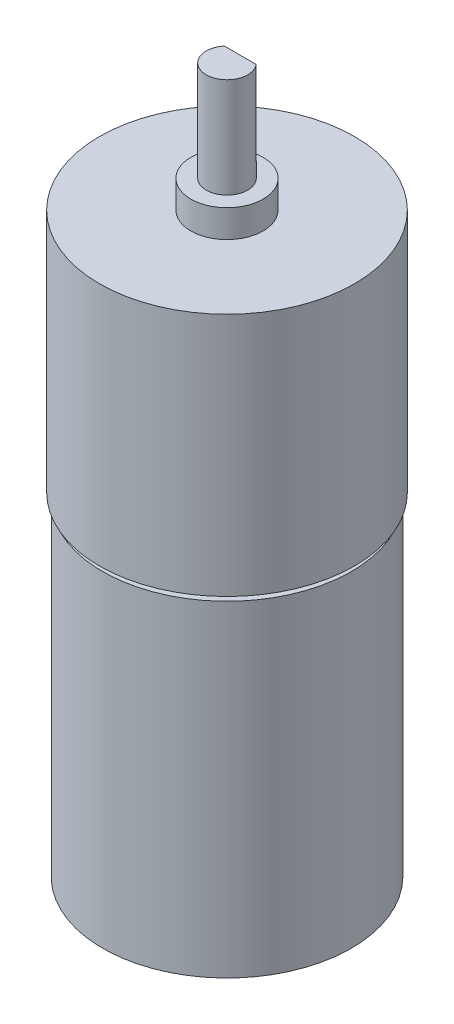
ISO-10303-21;
HEADER;
FILE_DESCRIPTION(('STEP AP214'),'2;1');
FILE_NAME('part.step','',(''),(''),'','','');
FILE_SCHEMA(('AUTOMOTIVE_DESIGN { 1 0 10303 214 1 1 1 1 }'));
ENDSEC;
DATA;
#1=APPLICATION_CONTEXT('core data for automotive mechanical design processes');
#2=APPLICATION_PROTOCOL_DEFINITION('international standard','automotive_design',2000,#1);
#3=PRODUCT_CONTEXT('',#1,'mechanical');
#4=PRODUCT('Part','Part','',(#3));
#5=PRODUCT_RELATED_PRODUCT_CATEGORY('part','',(#4));
#6=PRODUCT_DEFINITION_FORMATION('','',#4);
#7=PRODUCT_DEFINITION_CONTEXT('part definition',#1,'design');
#8=PRODUCT_DEFINITION('design','',#6,#7);
#9=PRODUCT_DEFINITION_SHAPE('','',#8);
#10=(LENGTH_UNIT() NAMED_UNIT(*) SI_UNIT(.MILLI.,.METRE.));
#11=(NAMED_UNIT(*) PLANE_ANGLE_UNIT() SI_UNIT($,.RADIAN.));
#12=(NAMED_UNIT(*) SI_UNIT($,.STERADIAN.) SOLID_ANGLE_UNIT());
#13=UNCERTAINTY_MEASURE_WITH_UNIT(LENGTH_MEASURE(1.E-05),#10,'distance_accuracy_value','');
#14=(GEOMETRIC_REPRESENTATION_CONTEXT(3) GLOBAL_UNCERTAINTY_ASSIGNED_CONTEXT((#13)) GLOBAL_UNIT_ASSIGNED_CONTEXT((#10,
#11,#12)) REPRESENTATION_CONTEXT('',''));
#15=CARTESIAN_POINT('',(0.,0.,0.));
#16=DIRECTION('',(0.,0.,1.));
#17=DIRECTION('',(1.,0.,0.));
#18=AXIS2_PLACEMENT_3D('',#15,#16,#17);
#19=CARTESIAN_POINT('',(0.,54.3,0.));
#20=DIRECTION('',(0.,-1.,0.));
#21=DIRECTION('',(0.,0.,-1.));
#22=AXIS2_PLACEMENT_3D('',#19,#20,#21);
#23=CYLINDRICAL_SURFACE('',#22,12.);
#24=CARTESIAN_POINT('',(0.,31.3,0.));
#25=DIRECTION('',(0.,-1.,0.));
#26=DIRECTION('',(0.,0.,-1.));
#27=AXIS2_PLACEMENT_3D('',#24,#25,#26);
#28=CIRCLE('',#27,12.);
#29=CARTESIAN_POINT('',(0.,31.3,-12.));
#30=VERTEX_POINT('',#29);
#31=EDGE_CURVE('E68',#30,#30,#28,.T.);
#32=CARTESIAN_POINT('',(0.,54.3,0.));
#33=DIRECTION('',(0.,1.,0.));
#34=DIRECTION('',(0.,0.,1.));
#35=AXIS2_PLACEMENT_3D('',#32,#33,#34);
#36=CIRCLE('',#35,12.);
#37=CARTESIAN_POINT('',(0.,54.3,-12.));
#38=VERTEX_POINT('',#37);
#39=EDGE_CURVE('E11',#38,#38,#36,.T.);
#40=CARTESIAN_POINT('',(0.,31.3,-12.));
#41=CARTESIAN_POINT('',(0.,31.5395833333333,-12.));
#42=CARTESIAN_POINT('',(0.,31.7791666666667,-12.));
#43=CARTESIAN_POINT('',(0.,32.2583333333333,-12.));
#44=CARTESIAN_POINT('',(0.,32.4979166666667,-12.));
#45=CARTESIAN_POINT('',(0.,32.9770833333333,-12.));
#46=CARTESIAN_POINT('',(0.,33.2166666666667,-12.));
#47=CARTESIAN_POINT('',(0.,33.6958333333333,-12.));
#48=CARTESIAN_POINT('',(0.,33.9354166666667,-12.));
#49=CARTESIAN_POINT('',(0.,34.4145833333333,-12.));
#50=CARTESIAN_POINT('',(0.,34.6541666666667,-12.));
#51=CARTESIAN_POINT('',(0.,35.1333333333333,-12.));
#52=CARTESIAN_POINT('',(0.,35.3729166666667,-12.));
#53=CARTESIAN_POINT('',(0.,35.8520833333333,-12.));
#54=CARTESIAN_POINT('',(0.,36.0916666666667,-12.));
#55=CARTESIAN_POINT('',(0.,36.5708333333333,-12.));
#56=CARTESIAN_POINT('',(0.,36.8104166666667,-12.));
#57=CARTESIAN_POINT('',(0.,37.2895833333333,-12.));
#58=CARTESIAN_POINT('',(0.,37.5291666666667,-12.));
#59=CARTESIAN_POINT('',(0.,38.0083333333333,-12.));
#60=CARTESIAN_POINT('',(0.,38.2479166666667,-12.));
#61=CARTESIAN_POINT('',(0.,38.7270833333333,-12.));
#62=CARTESIAN_POINT('',(0.,38.9666666666667,-12.));
#63=CARTESIAN_POINT('',(0.,39.4458333333333,-12.));
#64=CARTESIAN_POINT('',(0.,39.6854166666667,-12.));
#65=CARTESIAN_POINT('',(0.,40.1645833333333,-12.));
#66=CARTESIAN_POINT('',(0.,40.4041666666667,-12.));
#67=CARTESIAN_POINT('',(0.,40.8833333333333,-12.));
#68=CARTESIAN_POINT('',(0.,41.1229166666667,-12.));
#69=CARTESIAN_POINT('',(0.,41.6020833333333,-12.));
#70=CARTESIAN_POINT('',(0.,41.8416666666667,-12.));
#71=CARTESIAN_POINT('',(0.,42.3208333333333,-12.));
#72=CARTESIAN_POINT('',(0.,42.5604166666667,-12.));
#73=CARTESIAN_POINT('',(0.,43.0395833333333,-12.));
#74=CARTESIAN_POINT('',(0.,43.2791666666667,-12.));
#75=CARTESIAN_POINT('',(0.,43.7583333333333,-12.));
#76=CARTESIAN_POINT('',(0.,43.9979166666667,-12.));
#77=CARTESIAN_POINT('',(0.,44.4770833333333,-12.));
#78=CARTESIAN_POINT('',(0.,44.7166666666667,-12.));
#79=CARTESIAN_POINT('',(0.,45.1958333333333,-12.));
#80=CARTESIAN_POINT('',(0.,45.4354166666667,-12.));
#81=CARTESIAN_POINT('',(0.,45.9145833333333,-12.));
#82=CARTESIAN_POINT('',(0.,46.1541666666667,-12.));
#83=CARTESIAN_POINT('',(0.,46.6333333333333,-12.));
#84=CARTESIAN_POINT('',(0.,46.8729166666667,-12.));
#85=CARTESIAN_POINT('',(0.,47.3520833333333,-12.));
#86=CARTESIAN_POINT('',(0.,47.5916666666667,-12.));
#87=CARTESIAN_POINT('',(0.,48.0708333333333,-12.));
#88=CARTESIAN_POINT('',(0.,48.3104166666667,-12.));
#89=CARTESIAN_POINT('',(0.,48.7895833333333,-12.));
#90=CARTESIAN_POINT('',(0.,49.0291666666667,-12.));
#91=CARTESIAN_POINT('',(0.,49.5083333333333,-12.));
#92=CARTESIAN_POINT('',(0.,49.7479166666667,-12.));
#93=CARTESIAN_POINT('',(0.,50.2270833333333,-12.));
#94=CARTESIAN_POINT('',(0.,50.4666666666667,-12.));
#95=CARTESIAN_POINT('',(0.,50.9458333333333,-12.));
#96=CARTESIAN_POINT('',(0.,51.1854166666667,-12.));
#97=CARTESIAN_POINT('',(0.,51.6645833333333,-12.));
#98=CARTESIAN_POINT('',(0.,51.9041666666667,-12.));
#99=CARTESIAN_POINT('',(0.,52.3833333333333,-12.));
#100=CARTESIAN_POINT('',(0.,52.6229166666667,-12.));
#101=CARTESIAN_POINT('',(0.,53.1020833333333,-12.));
#102=CARTESIAN_POINT('',(0.,53.3416666666667,-12.));
#103=CARTESIAN_POINT('',(0.,53.8208333333333,-12.));
#104=CARTESIAN_POINT('',(0.,54.0604166666667,-12.));
#105=CARTESIAN_POINT('',(0.,54.3,-12.));
#106=B_SPLINE_CURVE_WITH_KNOTS('',3,(#40,#41,#42,#43,#44,#45,#46,#47,#48,#49,#50,#51,#52,#53,
#54,#55,#56,#57,#58,#59,#60,#61,#62,#63,#64,#65,#66,#67,#68,#69,#70,#71,#72,#73,#74,#75,#76,#77,
#78,#79,#80,#81,#82,#83,#84,#85,#86,#87,#88,#89,#90,#91,#92,#93,#94,#95,#96,#97,#98,#99,#100,
#101,#102,#103,#104,#105),.UNSPECIFIED.,.F.,.F.,(4,2,2,2,2,2,2,2,2,2,2,2,2,2,2,2,2,2,2,2,2,2,2,
2,2,2,2,2,2,2,2,2,4),(0.,0.718750000000004,1.43750000000001,2.15625,2.875,3.59375000000001,
4.3125,5.03125,5.75000000000001,6.46875,7.1875,7.90625,8.625,9.34375,10.0625,10.78125,11.5,
12.21875,12.9375,13.65625,14.375,15.09375,15.8125,16.53125,17.25,17.96875,18.6875,19.40625,
20.125,20.84375,21.5625,22.28125,23.),.UNSPECIFIED.);
#107=EDGE_CURVE('BSEAM37',#30,#38,#106,.T.);
#108=ORIENTED_EDGE('',*,*,#31,.F.);
#109=ORIENTED_EDGE('',*,*,#39,.F.);
#110=ORIENTED_EDGE('',*,*,#107,.T.);
#111=ORIENTED_EDGE('',*,*,#107,.F.);
#112=EDGE_LOOP('',(#108,#110,#109,#111));
#113=FACE_BOUND('',#112,.T.);
#114=ADVANCED_FACE('F37',(#113),#23,.T.);
#115=CARTESIAN_POINT('',(0.,54.3,0.));
#116=DIRECTION('',(0.,1.,0.));
#117=DIRECTION('',(0.,0.,1.));
#118=AXIS2_PLACEMENT_3D('',#115,#116,#117);
#119=PLANE('',#118);
#120=CARTESIAN_POINT('',(0.,54.3,0.));
#121=DIRECTION('',(0.,1.,0.));
#122=DIRECTION('',(0.,0.,1.));
#123=AXIS2_PLACEMENT_3D('',#120,#121,#122);
#124=CIRCLE('',#123,3.4);
#125=CARTESIAN_POINT('',(0.,54.3,3.4));
#126=VERTEX_POINT('',#125);
#127=EDGE_CURVE('E80',#126,#126,#124,.T.);
#128=ORIENTED_EDGE('',*,*,#127,.F.);
#129=EDGE_LOOP('',(#128));
#130=FACE_BOUND('',#129,.T.);
#131=ORIENTED_EDGE('',*,*,#39,.T.);
#132=EDGE_LOOP('',(#131));
#133=FACE_BOUND('',#132,.T.);
#134=ADVANCED_FACE('F90',(#130,#133),#119,.T.);
#135=CARTESIAN_POINT('',(0.,56.9,0.));
#136=DIRECTION('',(0.,1.,0.));
#137=DIRECTION('',(0.,0.,1.));
#138=AXIS2_PLACEMENT_3D('',#135,#136,#137);
#139=PLANE('',#138);
#140=CARTESIAN_POINT('',(0.,56.9,0.));
#141=DIRECTION('',(0.,1.,0.));
#142=DIRECTION('',(0.,0.,1.));
#143=AXIS2_PLACEMENT_3D('',#140,#141,#142);
#144=CIRCLE('',#143,3.4);
#145=CARTESIAN_POINT('',(0.,56.9,3.4));
#146=VERTEX_POINT('',#145);
#147=EDGE_CURVE('E44',#146,#146,#144,.T.);
#148=ORIENTED_EDGE('',*,*,#147,.T.);
#149=EDGE_LOOP('',(#148));
#150=FACE_BOUND('',#149,.T.);
#151=CARTESIAN_POINT('',(0.,56.9,0.));
#152=DIRECTION('',(0.,1.,0.));
#153=DIRECTION('',(0.,0.,1.));
#154=AXIS2_PLACEMENT_3D('',#151,#152,#153);
#155=CIRCLE('',#154,1.95);
#156=CARTESIAN_POINT('',(0.,56.9,1.95));
#157=VERTEX_POINT('',#156);
#158=EDGE_CURVE('E77',#157,#157,#155,.T.);
#159=ORIENTED_EDGE('',*,*,#158,.F.);
#160=EDGE_LOOP('',(#159));
#161=FACE_BOUND('',#160,.T.);
#162=ADVANCED_FACE('F93',(#150,#161),#139,.T.);
#163=CARTESIAN_POINT('',(0.,56.9,0.));
#164=DIRECTION('',(0.,-1.,0.));
#165=DIRECTION('',(0.,0.,-1.));
#166=AXIS2_PLACEMENT_3D('',#163,#164,#165);
#167=CYLINDRICAL_SURFACE('',#166,3.4);
#168=ORIENTED_EDGE('',*,*,#147,.F.);
#169=EDGE_LOOP('',(#168));
#170=FACE_BOUND('',#169,.T.);
#171=ORIENTED_EDGE('',*,*,#127,.T.);
#172=EDGE_LOOP('',(#171));
#173=FACE_BOUND('',#172,.T.);
#174=ADVANCED_FACE('F88',(#170,#173),#167,.T.);
#175=CARTESIAN_POINT('',(0.,66.3,0.));
#176=DIRECTION('',(0.,-1.,0.));
#177=DIRECTION('',(0.,0.,-1.));
#178=AXIS2_PLACEMENT_3D('',#175,#176,#177);
#179=CYLINDRICAL_SURFACE('',#178,1.95);
#180=CARTESIAN_POINT('',(0.,66.3,0.));
#181=DIRECTION('',(0.,1.,0.));
#182=DIRECTION('',(0.,0.,1.));
#183=AXIS2_PLACEMENT_3D('',#180,#181,#182);
#184=CIRCLE('',#183,1.95);
#185=CARTESIAN_POINT('',(-1.5,66.3,-1.24599357943771));
#186=VERTEX_POINT('',#185);
#187=CARTESIAN_POINT('',(1.5,66.3,-1.24599357943771));
#188=VERTEX_POINT('',#187);
#189=EDGE_CURVE('E74',#186,#188,#184,.T.);
#190=ORIENTED_EDGE('',*,*,#189,.F.);
#191=DIRECTION('',(0.,1.,0.));
#192=VECTOR('',#191,1.);
#193=CARTESIAN_POINT('',(-1.5,58.3,-1.24599357943771));
#194=LINE('',#193,#192);
#195=CARTESIAN_POINT('',(-1.5,58.3,-1.24599357943771));
#196=VERTEX_POINT('',#195);
#197=EDGE_CURVE('E51',#196,#186,#194,.T.);
#198=ORIENTED_EDGE('',*,*,#197,.F.);
#199=CARTESIAN_POINT('',(0.,58.3,0.));
#200=DIRECTION('',(0.,1.,0.));
#201=DIRECTION('',(0.,0.,-1.));
#202=AXIS2_PLACEMENT_3D('',#199,#200,#201);
#203=CIRCLE('',#202,1.95);
#204=CARTESIAN_POINT('',(1.5,58.3,-1.24599357943771));
#205=VERTEX_POINT('',#204);
#206=EDGE_CURVE('E67',#205,#196,#203,.T.);
#207=ORIENTED_EDGE('',*,*,#206,.F.);
#208=DIRECTION('',(0.,1.,0.));
#209=VECTOR('',#208,1.);
#210=CARTESIAN_POINT('',(1.5,58.3,-1.24599357943771));
#211=LINE('',#210,#209);
#212=EDGE_CURVE('E57',#205,#188,#211,.T.);
#213=ORIENTED_EDGE('',*,*,#212,.T.);
#214=EDGE_LOOP('',(#190,#198,#207,#213));
#215=FACE_BOUND('',#214,.T.);
#216=ORIENTED_EDGE('',*,*,#158,.T.);
#217=EDGE_LOOP('',(#216));
#218=FACE_BOUND('',#217,.T.);
#219=ADVANCED_FACE('F72',(#215,#218),#179,.T.);
#220=CARTESIAN_POINT('',(0.,66.3,0.));
#221=DIRECTION('',(0.,1.,0.));
#222=DIRECTION('',(0.,0.,1.));
#223=AXIS2_PLACEMENT_3D('',#220,#221,#222);
#224=PLANE('',#223);
#225=DIRECTION('',(1.,0.,0.));
#226=VECTOR('',#225,1.);
#227=CARTESIAN_POINT('',(-1.5,66.3,-1.24599357943771));
#228=LINE('',#227,#226);
#229=EDGE_CURVE('E62',#186,#188,#228,.T.);
#230=ORIENTED_EDGE('',*,*,#229,.F.);
#231=ORIENTED_EDGE('',*,*,#189,.T.);
#232=EDGE_LOOP('',(#230,#231));
#233=FACE_BOUND('',#232,.T.);
#234=ADVANCED_FACE('F76',(#233),#224,.T.);
#235=CARTESIAN_POINT('',(-1.5,58.3,-1.24599357943771));
#236=DIRECTION('',(0.,0.,1.));
#237=DIRECTION('',(1.,0.,0.));
#238=AXIS2_PLACEMENT_3D('',#235,#236,#237);
#239=PLANE('',#238);
#240=ORIENTED_EDGE('',*,*,#229,.T.);
#241=ORIENTED_EDGE('',*,*,#212,.F.);
#242=DIRECTION('',(1.,0.,0.));
#243=VECTOR('',#242,1.);
#244=CARTESIAN_POINT('',(-1.5,58.3,-1.24599357943771));
#245=LINE('',#244,#243);
#246=EDGE_CURVE('E112',#196,#205,#245,.T.);
#247=ORIENTED_EDGE('',*,*,#246,.F.);
#248=ORIENTED_EDGE('',*,*,#197,.T.);
#249=EDGE_LOOP('',(#240,#241,#247,#248));
#250=FACE_BOUND('',#249,.T.);
#251=ADVANCED_FACE('F63',(#250),#239,.F.);
#252=CARTESIAN_POINT('',(0.,58.3,0.));
#253=DIRECTION('',(0.,-1.,0.));
#254=DIRECTION('',(0.,0.,-1.));
#255=AXIS2_PLACEMENT_3D('',#252,#253,#254);
#256=PLANE('',#255);
#257=ORIENTED_EDGE('',*,*,#206,.T.);
#258=ORIENTED_EDGE('',*,*,#246,.T.);
#259=EDGE_LOOP('',(#257,#258));
#260=FACE_BOUND('',#259,.T.);
#261=ADVANCED_FACE('F114',(#260),#256,.F.);
#262=CARTESIAN_POINT('',(0.,31.3,-12.));
#263=DIRECTION('',(0.,1.,0.));
#264=DIRECTION('',(0.,0.,1.));
#265=AXIS2_PLACEMENT_3D('',#262,#263,#264);
#266=PLANE('',#265);
#267=CARTESIAN_POINT('',(0.,31.3,0.));
#268=DIRECTION('',(0.,-1.,0.));
#269=DIRECTION('',(0.,0.,-1.));
#270=AXIS2_PLACEMENT_3D('',#267,#268,#269);
#271=CIRCLE('',#270,11.);
#272=CARTESIAN_POINT('',(0.,31.3,-11.));
#273=VERTEX_POINT('',#272);
#274=EDGE_CURVE('E104',#273,#273,#271,.T.);
#275=ORIENTED_EDGE('',*,*,#274,.F.);
#276=EDGE_LOOP('',(#275));
#277=FACE_BOUND('',#276,.T.);
#278=ORIENTED_EDGE('',*,*,#31,.T.);
#279=EDGE_LOOP('',(#278));
#280=FACE_BOUND('',#279,.T.);
#281=ADVANCED_FACE('F116',(#277,#280),#266,.F.);
#282=CARTESIAN_POINT('',(0.,-3.315,0.));
#283=DIRECTION('',(0.,-1.,0.));
#284=DIRECTION('',(0.,0.,-1.));
#285=AXIS2_PLACEMENT_3D('',#282,#283,#284);
#286=CYLINDRICAL_SURFACE('',#285,11.);
#287=CARTESIAN_POINT('',(0.,30.7,0.));
#288=DIRECTION('',(0.,-1.,0.));
#289=DIRECTION('',(0.,0.,-1.));
#290=AXIS2_PLACEMENT_3D('',#287,#288,#289);
#291=CIRCLE('',#290,11.);
#292=CARTESIAN_POINT('',(0.,30.7,-11.));
#293=VERTEX_POINT('',#292);
#294=EDGE_CURVE('E107',#293,#293,#291,.T.);
#295=ORIENTED_EDGE('',*,*,#294,.F.);
#296=EDGE_LOOP('',(#295));
#297=FACE_BOUND('',#296,.T.);
#298=ORIENTED_EDGE('',*,*,#274,.T.);
#299=EDGE_LOOP('',(#298));
#300=FACE_BOUND('',#299,.T.);
#301=ADVANCED_FACE('F122',(#297,#300),#286,.T.);
#302=CARTESIAN_POINT('',(0.,30.7,-11.7));
#303=DIRECTION('',(0.,-1.,0.));
#304=DIRECTION('',(0.,0.,-1.));
#305=AXIS2_PLACEMENT_3D('',#302,#303,#304);
#306=PLANE('',#305);
#307=CARTESIAN_POINT('',(0.,30.7,0.));
#308=DIRECTION('',(0.,-1.,0.));
#309=DIRECTION('',(0.,0.,-1.));
#310=AXIS2_PLACEMENT_3D('',#307,#308,#309);
#311=CIRCLE('',#310,11.7);
#312=CARTESIAN_POINT('',(0.,30.7,-11.7));
#313=VERTEX_POINT('',#312);
#314=EDGE_CURVE('E150',#313,#313,#311,.T.);
#315=ORIENTED_EDGE('',*,*,#314,.F.);
#316=EDGE_LOOP('',(#315));
#317=FACE_BOUND('',#316,.T.);
#318=ORIENTED_EDGE('',*,*,#294,.T.);
#319=EDGE_LOOP('',(#318));
#320=FACE_BOUND('',#319,.T.);
#321=ADVANCED_FACE('F144',(#317,#320),#306,.F.);
#322=CARTESIAN_POINT('',(0.,-3.315,0.));
#323=DIRECTION('',(0.,-1.,0.));
#324=DIRECTION('',(0.,0.,-1.));
#325=AXIS2_PLACEMENT_3D('',#322,#323,#324);
#326=CYLINDRICAL_SURFACE('',#325,11.7);
#327=CARTESIAN_POINT('',(0.,0.,0.));
#328=DIRECTION('',(0.,-1.,0.));
#329=DIRECTION('',(0.,0.,-1.));
#330=AXIS2_PLACEMENT_3D('',#327,#328,#329);
#331=CIRCLE('',#330,11.7);
#332=CARTESIAN_POINT('',(0.,0.,-11.7));
#333=VERTEX_POINT('',#332);
#334=EDGE_CURVE('E149',#333,#333,#331,.T.);
#335=ORIENTED_EDGE('',*,*,#334,.F.);
#336=EDGE_LOOP('',(#335));
#337=FACE_BOUND('',#336,.T.);
#338=ORIENTED_EDGE('',*,*,#314,.T.);
#339=EDGE_LOOP('',(#338));
#340=FACE_BOUND('',#339,.T.);
#341=ADVANCED_FACE('F139',(#337,#340),#326,.T.);
#342=CARTESIAN_POINT('',(0.,0.,0.));
#343=DIRECTION('',(0.,1.,0.));
#344=DIRECTION('',(0.,0.,1.));
#345=AXIS2_PLACEMENT_3D('',#342,#343,#344);
#346=PLANE('',#345);
#347=ORIENTED_EDGE('',*,*,#334,.T.);
#348=EDGE_LOOP('',(#347));
#349=FACE_BOUND('',#348,.T.);
#350=ADVANCED_FACE('F137',(#349),#346,.F.);
#351=CLOSED_SHELL('',(#114,#134,#162,#174,#219,#234,#251,#261,#281,#301,#321,#341,#350));
#352=MANIFOLD_SOLID_BREP('B2',#351);
#353=ADVANCED_BREP_SHAPE_REPRESENTATION('',(#18,#352),#14);
#354=SHAPE_DEFINITION_REPRESENTATION(#9,#353);
ENDSEC;
END-ISO-10303-21;
